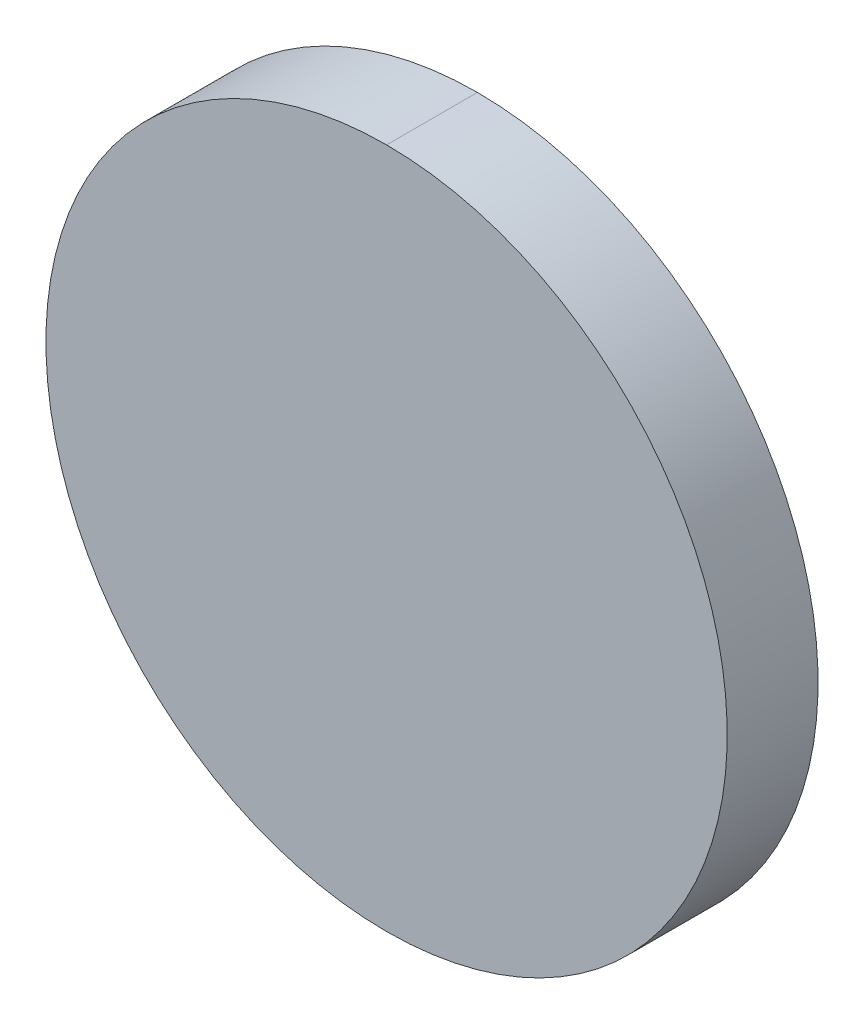
ISO-10303-21;
HEADER;
FILE_DESCRIPTION(('STEP AP214'),'2;1');
FILE_NAME('part.step','',(''),(''),'','','');
FILE_SCHEMA(('AUTOMOTIVE_DESIGN { 1 0 10303 214 1 1 1 1 }'));
ENDSEC;
DATA;
#1=APPLICATION_CONTEXT('core data for automotive mechanical design processes');
#2=APPLICATION_PROTOCOL_DEFINITION('international standard','automotive_design',2000,#1);
#3=PRODUCT_CONTEXT('',#1,'mechanical');
#4=PRODUCT('Part','Part','',(#3));
#5=PRODUCT_RELATED_PRODUCT_CATEGORY('part','',(#4));
#6=PRODUCT_DEFINITION_FORMATION('','',#4);
#7=PRODUCT_DEFINITION_CONTEXT('part definition',#1,'design');
#8=PRODUCT_DEFINITION('design','',#6,#7);
#9=PRODUCT_DEFINITION_SHAPE('','',#8);
#10=(LENGTH_UNIT() NAMED_UNIT(*) SI_UNIT(.MILLI.,.METRE.));
#11=(NAMED_UNIT(*) PLANE_ANGLE_UNIT() SI_UNIT($,.RADIAN.));
#12=(NAMED_UNIT(*) SI_UNIT($,.STERADIAN.) SOLID_ANGLE_UNIT());
#13=UNCERTAINTY_MEASURE_WITH_UNIT(LENGTH_MEASURE(1.E-05),#10,'distance_accuracy_value','');
#14=(GEOMETRIC_REPRESENTATION_CONTEXT(3) GLOBAL_UNCERTAINTY_ASSIGNED_CONTEXT((#13)) GLOBAL_UNIT_ASSIGNED_CONTEXT((#10,
#11,#12)) REPRESENTATION_CONTEXT('',''));
#15=CARTESIAN_POINT('',(0.,0.,0.));
#16=DIRECTION('',(0.,0.,1.));
#17=DIRECTION('',(1.,0.,0.));
#18=AXIS2_PLACEMENT_3D('',#15,#16,#17);
#19=CARTESIAN_POINT('',(-271.1665276998,265.1245773803,-1.600000380954));
#20=DIRECTION('',(0.,0.,-1.));
#21=DIRECTION('',(0.,-1.,0.));
#22=AXIS2_PLACEMENT_3D('',#19,#20,#21);
#23=CYLINDRICAL_SURFACE('',#22,1.5);
#24=CARTESIAN_POINT('',(-271.1665276998,265.1245773803,-4.8));
#25=DIRECTION('',(0.,0.,-1.));
#26=DIRECTION('',(0.,-1.,0.));
#27=AXIS2_PLACEMENT_3D('',#24,#25,#26);
#28=CIRCLE('',#27,1.5);
#29=CARTESIAN_POINT('',(-271.1665276998,263.6245773803,-4.8));
#30=VERTEX_POINT('',#29);
#31=CARTESIAN_POINT('',(-271.1665276998,266.6245773803,-4.8));
#32=VERTEX_POINT('',#31);
#33=EDGE_CURVE('E52',#30,#32,#28,.T.);
#34=ORIENTED_EDGE('',*,*,#33,.F.);
#35=DIRECTION('',(0.,0.,1.));
#36=VECTOR('',#35,1.);
#37=CARTESIAN_POINT('',(-271.1665276998,263.6245773803,-4.8));
#38=LINE('',#37,#36);
#39=CARTESIAN_POINT('',(-271.1665276998,263.6245773803,-4.4));
#40=VERTEX_POINT('',#39);
#41=EDGE_CURVE('E40',#30,#40,#38,.T.);
#42=ORIENTED_EDGE('',*,*,#41,.T.);
#43=CARTESIAN_POINT('',(-271.1665276998,265.1245773803,-4.4));
#44=DIRECTION('',(0.,0.,1.));
#45=DIRECTION('',(0.,1.,0.));
#46=AXIS2_PLACEMENT_3D('',#43,#44,#45);
#47=CIRCLE('',#46,1.5);
#48=CARTESIAN_POINT('',(-271.1665276998,266.6245773803,-4.4));
#49=VERTEX_POINT('',#48);
#50=EDGE_CURVE('E11',#49,#40,#47,.T.);
#51=ORIENTED_EDGE('',*,*,#50,.F.);
#52=DIRECTION('',(0.,0.,1.));
#53=VECTOR('',#52,1.);
#54=CARTESIAN_POINT('',(-271.1665276998,266.6245773803,-4.8));
#55=LINE('',#54,#53);
#56=EDGE_CURVE('E48',#32,#49,#55,.T.);
#57=ORIENTED_EDGE('',*,*,#56,.F.);
#58=EDGE_LOOP('',(#34,#42,#51,#57));
#59=FACE_BOUND('',#58,.T.);
#60=ADVANCED_FACE('F16',(#59),#23,.T.);
#61=CARTESIAN_POINT('',(-217.6751787571,251.8245785125,-4.4));
#62=DIRECTION('',(0.,0.,-1.));
#63=DIRECTION('',(0.,-1.,0.));
#64=AXIS2_PLACEMENT_3D('',#61,#62,#63);
#65=PLANE('',#64);
#66=ORIENTED_EDGE('',*,*,#50,.T.);
#67=CARTESIAN_POINT('',(-271.1665276998,265.1245773803,-4.4));
#68=DIRECTION('',(0.,0.,1.));
#69=DIRECTION('',(0.,-1.,0.));
#70=AXIS2_PLACEMENT_3D('',#67,#68,#69);
#71=CIRCLE('',#70,1.5);
#72=EDGE_CURVE('E24',#40,#49,#71,.T.);
#73=ORIENTED_EDGE('',*,*,#72,.T.);
#74=EDGE_LOOP('',(#66,#73));
#75=FACE_BOUND('',#74,.T.);
#76=ADVANCED_FACE('F65',(#75),#65,.F.);
#77=CARTESIAN_POINT('',(-271.1665276998,265.1245773803,-1.600000380954));
#78=DIRECTION('',(0.,0.,-1.));
#79=DIRECTION('',(0.,-1.,0.));
#80=AXIS2_PLACEMENT_3D('',#77,#78,#79);
#81=CYLINDRICAL_SURFACE('',#80,1.5);
#82=ORIENTED_EDGE('',*,*,#41,.F.);
#83=CARTESIAN_POINT('',(-271.1665276998,265.1245773803,-4.8));
#84=DIRECTION('',(0.,0.,-1.));
#85=DIRECTION('',(0.,1.,0.));
#86=AXIS2_PLACEMENT_3D('',#83,#84,#85);
#87=CIRCLE('',#86,1.5);
#88=EDGE_CURVE('E44',#32,#30,#87,.T.);
#89=ORIENTED_EDGE('',*,*,#88,.F.);
#90=ORIENTED_EDGE('',*,*,#56,.T.);
#91=ORIENTED_EDGE('',*,*,#72,.F.);
#92=EDGE_LOOP('',(#82,#89,#90,#91));
#93=FACE_BOUND('',#92,.T.);
#94=ADVANCED_FACE('F42',(#93),#81,.T.);
#95=CARTESIAN_POINT('',(-217.6751787571,251.8245785125,-4.8));
#96=DIRECTION('',(0.,0.,-1.));
#97=DIRECTION('',(0.,-1.,0.));
#98=AXIS2_PLACEMENT_3D('',#95,#96,#97);
#99=PLANE('',#98);
#100=ORIENTED_EDGE('',*,*,#33,.T.);
#101=ORIENTED_EDGE('',*,*,#88,.T.);
#102=EDGE_LOOP('',(#100,#101));
#103=FACE_BOUND('',#102,.T.);
#104=ADVANCED_FACE('F51',(#103),#99,.T.);
#105=CLOSED_SHELL('',(#60,#76,#94,#104));
#106=MANIFOLD_SOLID_BREP('B1',#105);
#107=ADVANCED_BREP_SHAPE_REPRESENTATION('',(#18,#106),#14);
#108=SHAPE_DEFINITION_REPRESENTATION(#9,#107);
ENDSEC;
END-ISO-10303-21;
